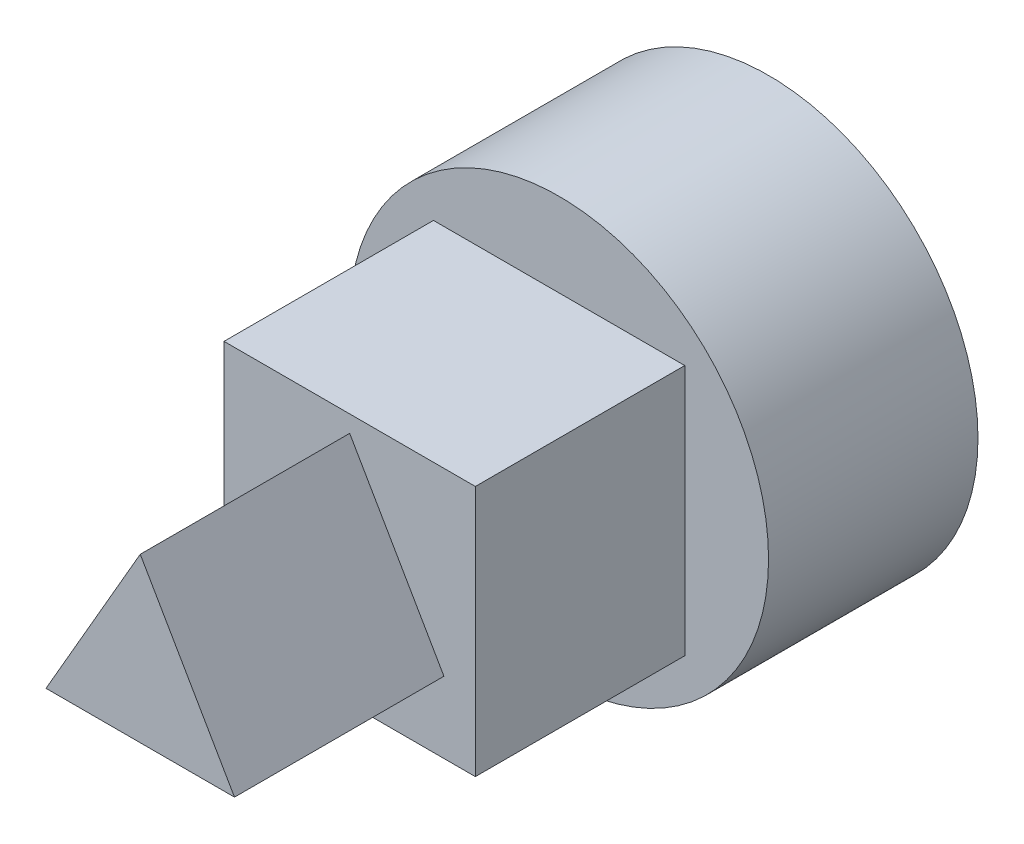
ISO-10303-21;
HEADER;
FILE_DESCRIPTION(('STEP AP214'),'2;1');
FILE_NAME('part.step','',(''),(''),'','','');
FILE_SCHEMA(('AUTOMOTIVE_DESIGN { 1 0 10303 214 1 1 1 1 }'));
ENDSEC;
DATA;
#1=APPLICATION_CONTEXT('core data for automotive mechanical design processes');
#2=APPLICATION_PROTOCOL_DEFINITION('international standard','automotive_design',2000,#1);
#3=PRODUCT_CONTEXT('',#1,'mechanical');
#4=PRODUCT('Part','Part','',(#3));
#5=PRODUCT_RELATED_PRODUCT_CATEGORY('part','',(#4));
#6=PRODUCT_DEFINITION_FORMATION('','',#4);
#7=PRODUCT_DEFINITION_CONTEXT('part definition',#1,'design');
#8=PRODUCT_DEFINITION('design','',#6,#7);
#9=PRODUCT_DEFINITION_SHAPE('','',#8);
#10=(LENGTH_UNIT() NAMED_UNIT(*) SI_UNIT(.MILLI.,.METRE.));
#11=(NAMED_UNIT(*) PLANE_ANGLE_UNIT() SI_UNIT($,.RADIAN.));
#12=(NAMED_UNIT(*) SI_UNIT($,.STERADIAN.) SOLID_ANGLE_UNIT());
#13=UNCERTAINTY_MEASURE_WITH_UNIT(LENGTH_MEASURE(1.E-05),#10,'distance_accuracy_value','');
#14=(GEOMETRIC_REPRESENTATION_CONTEXT(3) GLOBAL_UNCERTAINTY_ASSIGNED_CONTEXT((#13)) GLOBAL_UNIT_ASSIGNED_CONTEXT((#10,
#11,#12)) REPRESENTATION_CONTEXT('',''));
#15=CARTESIAN_POINT('',(0.,0.,0.));
#16=DIRECTION('',(0.,0.,1.));
#17=DIRECTION('',(1.,0.,0.));
#18=AXIS2_PLACEMENT_3D('',#15,#16,#17);
#19=CARTESIAN_POINT('',(0.,-12.9903810567666,150.));
#20=DIRECTION('',(0.,1.,0.));
#21=DIRECTION('',(0.,0.,1.));
#22=AXIS2_PLACEMENT_3D('',#19,#20,#21);
#23=PLANE('',#22);
#24=DIRECTION('',(0.,0.,-1.));
#25=VECTOR('',#24,1.);
#26=CARTESIAN_POINT('',(-22.5,-12.9903810567666,150.));
#27=LINE('',#26,#25);
#28=CARTESIAN_POINT('',(-22.5,-12.9903810567666,150.));
#29=VERTEX_POINT('',#28);
#30=CARTESIAN_POINT('',(-22.5,-12.9903810567666,100.));
#31=VERTEX_POINT('',#30);
#32=EDGE_CURVE('E181',#29,#31,#27,.T.);
#33=ORIENTED_EDGE('',*,*,#32,.T.);
#34=DIRECTION('',(1.,0.,0.));
#35=VECTOR('',#34,1.);
#36=CARTESIAN_POINT('',(0.,-12.9903810567666,100.));
#37=LINE('',#36,#35);
#38=CARTESIAN_POINT('',(22.5,-12.9903810567666,100.));
#39=VERTEX_POINT('',#38);
#40=EDGE_CURVE('E144',#31,#39,#37,.T.);
#41=ORIENTED_EDGE('',*,*,#40,.T.);
#42=DIRECTION('',(0.,0.,-1.));
#43=VECTOR('',#42,1.);
#44=CARTESIAN_POINT('',(22.5,-12.9903810567666,150.));
#45=LINE('',#44,#43);
#46=CARTESIAN_POINT('',(22.5,-12.9903810567666,150.));
#47=VERTEX_POINT('',#46);
#48=EDGE_CURVE('E11',#47,#39,#45,.T.);
#49=ORIENTED_EDGE('',*,*,#48,.F.);
#50=DIRECTION('',(1.,0.,0.));
#51=VECTOR('',#50,1.);
#52=CARTESIAN_POINT('',(0.,-12.9903810567666,150.));
#53=LINE('',#52,#51);
#54=EDGE_CURVE('E171',#29,#47,#53,.T.);
#55=ORIENTED_EDGE('',*,*,#54,.F.);
#56=EDGE_LOOP('',(#33,#41,#49,#55));
#57=FACE_BOUND('',#56,.T.);
#58=ADVANCED_FACE('F43',(#57),#23,.F.);
#59=CARTESIAN_POINT('',(11.25,6.49519052838329,150.));
#60=DIRECTION('',(-0.866025403784439,-0.5,0.));
#61=DIRECTION('',(0.5,-0.866025403784439,0.));
#62=AXIS2_PLACEMENT_3D('',#59,#60,#61);
#63=PLANE('',#62);
#64=ORIENTED_EDGE('',*,*,#48,.T.);
#65=DIRECTION('',(-0.5,0.866025403784439,0.));
#66=VECTOR('',#65,1.);
#67=CARTESIAN_POINT('',(11.25,6.49519052838329,100.));
#68=LINE('',#67,#66);
#69=CARTESIAN_POINT('',(0.,25.9807621135332,100.));
#70=VERTEX_POINT('',#69);
#71=EDGE_CURVE('E136',#39,#70,#68,.T.);
#72=ORIENTED_EDGE('',*,*,#71,.T.);
#73=DIRECTION('',(0.,0.,-1.));
#74=VECTOR('',#73,1.);
#75=CARTESIAN_POINT('',(0.,25.9807621135332,150.));
#76=LINE('',#75,#74);
#77=CARTESIAN_POINT('',(0.,25.9807621135332,150.));
#78=VERTEX_POINT('',#77);
#79=EDGE_CURVE('E51',#78,#70,#76,.T.);
#80=ORIENTED_EDGE('',*,*,#79,.F.);
#81=DIRECTION('',(-0.5,0.866025403784439,0.));
#82=VECTOR('',#81,1.);
#83=CARTESIAN_POINT('',(11.25,6.49519052838329,150.));
#84=LINE('',#83,#82);
#85=EDGE_CURVE('E175',#47,#78,#84,.T.);
#86=ORIENTED_EDGE('',*,*,#85,.F.);
#87=EDGE_LOOP('',(#64,#72,#80,#86));
#88=FACE_BOUND('',#87,.T.);
#89=ADVANCED_FACE('F192',(#88),#63,.F.);
#90=CARTESIAN_POINT('',(-11.25,6.49519052838329,150.));
#91=DIRECTION('',(0.866025403784439,-0.5,0.));
#92=DIRECTION('',(0.5,0.866025403784439,0.));
#93=AXIS2_PLACEMENT_3D('',#90,#91,#92);
#94=PLANE('',#93);
#95=ORIENTED_EDGE('',*,*,#79,.T.);
#96=DIRECTION('',(-0.5,-0.866025403784439,0.));
#97=VECTOR('',#96,1.);
#98=CARTESIAN_POINT('',(-11.25,6.49519052838329,100.));
#99=LINE('',#98,#97);
#100=EDGE_CURVE('E148',#70,#31,#99,.T.);
#101=ORIENTED_EDGE('',*,*,#100,.T.);
#102=ORIENTED_EDGE('',*,*,#32,.F.);
#103=DIRECTION('',(-0.5,-0.866025403784439,0.));
#104=VECTOR('',#103,1.);
#105=CARTESIAN_POINT('',(-11.25,6.49519052838329,150.));
#106=LINE('',#105,#104);
#107=EDGE_CURVE('E178',#78,#29,#106,.T.);
#108=ORIENTED_EDGE('',*,*,#107,.F.);
#109=EDGE_LOOP('',(#95,#101,#102,#108));
#110=FACE_BOUND('',#109,.T.);
#111=ADVANCED_FACE('F189',(#110),#94,.F.);
#112=CARTESIAN_POINT('',(0.,0.,150.));
#113=DIRECTION('',(0.,0.,1.));
#114=DIRECTION('',(1.,0.,0.));
#115=AXIS2_PLACEMENT_3D('',#112,#113,#114);
#116=PLANE('',#115);
#117=ORIENTED_EDGE('',*,*,#54,.T.);
#118=ORIENTED_EDGE('',*,*,#85,.T.);
#119=ORIENTED_EDGE('',*,*,#107,.T.);
#120=EDGE_LOOP('',(#117,#118,#119));
#121=FACE_BOUND('',#120,.T.);
#122=ADVANCED_FACE('F200',(#121),#116,.T.);
#123=CARTESIAN_POINT('',(0.,-30.,100.));
#124=DIRECTION('',(0.,1.,0.));
#125=DIRECTION('',(0.,0.,1.));
#126=AXIS2_PLACEMENT_3D('',#123,#124,#125);
#127=PLANE('',#126);
#128=DIRECTION('',(0.,0.,-1.));
#129=VECTOR('',#128,1.);
#130=CARTESIAN_POINT('',(-30.,-30.,100.));
#131=LINE('',#130,#129);
#132=CARTESIAN_POINT('',(-30.,-30.,100.));
#133=VERTEX_POINT('',#132);
#134=CARTESIAN_POINT('',(-30.,-30.,50.));
#135=VERTEX_POINT('',#134);
#136=EDGE_CURVE('E116',#133,#135,#131,.T.);
#137=ORIENTED_EDGE('',*,*,#136,.T.);
#138=DIRECTION('',(1.,0.,0.));
#139=VECTOR('',#138,1.);
#140=CARTESIAN_POINT('',(0.,-30.,50.));
#141=LINE('',#140,#139);
#142=CARTESIAN_POINT('',(30.,-30.,50.));
#143=VERTEX_POINT('',#142);
#144=EDGE_CURVE('E58',#135,#143,#141,.T.);
#145=ORIENTED_EDGE('',*,*,#144,.T.);
#146=DIRECTION('',(0.,0.,-1.));
#147=VECTOR('',#146,1.);
#148=CARTESIAN_POINT('',(30.,-30.,100.));
#149=LINE('',#148,#147);
#150=CARTESIAN_POINT('',(30.,-30.,100.));
#151=VERTEX_POINT('',#150);
#152=EDGE_CURVE('E168',#151,#143,#149,.T.);
#153=ORIENTED_EDGE('',*,*,#152,.F.);
#154=DIRECTION('',(1.,0.,0.));
#155=VECTOR('',#154,1.);
#156=CARTESIAN_POINT('',(0.,-30.,100.));
#157=LINE('',#156,#155);
#158=EDGE_CURVE('E152',#133,#151,#157,.T.);
#159=ORIENTED_EDGE('',*,*,#158,.F.);
#160=EDGE_LOOP('',(#137,#145,#153,#159));
#161=FACE_BOUND('',#160,.T.);
#162=ADVANCED_FACE('F202',(#161),#127,.F.);
#163=CARTESIAN_POINT('',(30.,0.,100.));
#164=DIRECTION('',(-1.,0.,0.));
#165=DIRECTION('',(0.,0.,1.));
#166=AXIS2_PLACEMENT_3D('',#163,#164,#165);
#167=PLANE('',#166);
#168=ORIENTED_EDGE('',*,*,#152,.T.);
#169=DIRECTION('',(0.,1.,0.));
#170=VECTOR('',#169,1.);
#171=CARTESIAN_POINT('',(30.,0.,50.));
#172=LINE('',#171,#170);
#173=CARTESIAN_POINT('',(30.,30.,50.));
#174=VERTEX_POINT('',#173);
#175=EDGE_CURVE('E65',#143,#174,#172,.T.);
#176=ORIENTED_EDGE('',*,*,#175,.T.);
#177=DIRECTION('',(0.,0.,-1.));
#178=VECTOR('',#177,1.);
#179=CARTESIAN_POINT('',(30.,30.,100.));
#180=LINE('',#179,#178);
#181=CARTESIAN_POINT('',(30.,30.,100.));
#182=VERTEX_POINT('',#181);
#183=EDGE_CURVE('E115',#182,#174,#180,.T.);
#184=ORIENTED_EDGE('',*,*,#183,.F.);
#185=DIRECTION('',(0.,1.,0.));
#186=VECTOR('',#185,1.);
#187=CARTESIAN_POINT('',(30.,0.,100.));
#188=LINE('',#187,#186);
#189=EDGE_CURVE('E156',#151,#182,#188,.T.);
#190=ORIENTED_EDGE('',*,*,#189,.F.);
#191=EDGE_LOOP('',(#168,#176,#184,#190));
#192=FACE_BOUND('',#191,.T.);
#193=ADVANCED_FACE('F208',(#192),#167,.F.);
#194=CARTESIAN_POINT('',(0.,30.,100.));
#195=DIRECTION('',(0.,1.,0.));
#196=DIRECTION('',(0.,0.,1.));
#197=AXIS2_PLACEMENT_3D('',#194,#195,#196);
#198=PLANE('',#197);
#199=DIRECTION('',(1.,0.,0.));
#200=VECTOR('',#199,1.);
#201=CARTESIAN_POINT('',(0.,30.,50.));
#202=LINE('',#201,#200);
#203=CARTESIAN_POINT('',(-30.,30.,50.));
#204=VERTEX_POINT('',#203);
#205=EDGE_CURVE('E119',#204,#174,#202,.T.);
#206=ORIENTED_EDGE('',*,*,#205,.F.);
#207=DIRECTION('',(0.,0.,-1.));
#208=VECTOR('',#207,1.);
#209=CARTESIAN_POINT('',(-30.,30.,100.));
#210=LINE('',#209,#208);
#211=CARTESIAN_POINT('',(-30.,30.,100.));
#212=VERTEX_POINT('',#211);
#213=EDGE_CURVE('E104',#212,#204,#210,.T.);
#214=ORIENTED_EDGE('',*,*,#213,.F.);
#215=DIRECTION('',(1.,0.,0.));
#216=VECTOR('',#215,1.);
#217=CARTESIAN_POINT('',(0.,30.,100.));
#218=LINE('',#217,#216);
#219=EDGE_CURVE('E159',#212,#182,#218,.T.);
#220=ORIENTED_EDGE('',*,*,#219,.T.);
#221=ORIENTED_EDGE('',*,*,#183,.T.);
#222=EDGE_LOOP('',(#206,#214,#220,#221));
#223=FACE_BOUND('',#222,.T.);
#224=ADVANCED_FACE('F120',(#223),#198,.T.);
#225=CARTESIAN_POINT('',(-30.,0.,100.));
#226=DIRECTION('',(-1.,0.,0.));
#227=DIRECTION('',(0.,0.,1.));
#228=AXIS2_PLACEMENT_3D('',#225,#226,#227);
#229=PLANE('',#228);
#230=DIRECTION('',(0.,1.,0.));
#231=VECTOR('',#230,1.);
#232=CARTESIAN_POINT('',(-30.,0.,50.));
#233=LINE('',#232,#231);
#234=EDGE_CURVE('E108',#135,#204,#233,.T.);
#235=ORIENTED_EDGE('',*,*,#234,.F.);
#236=ORIENTED_EDGE('',*,*,#136,.F.);
#237=DIRECTION('',(0.,1.,0.));
#238=VECTOR('',#237,1.);
#239=CARTESIAN_POINT('',(-30.,0.,100.));
#240=LINE('',#239,#238);
#241=EDGE_CURVE('E110',#133,#212,#240,.T.);
#242=ORIENTED_EDGE('',*,*,#241,.T.);
#243=ORIENTED_EDGE('',*,*,#213,.T.);
#244=EDGE_LOOP('',(#235,#236,#242,#243));
#245=FACE_BOUND('',#244,.T.);
#246=ADVANCED_FACE('F106',(#245),#229,.T.);
#247=CARTESIAN_POINT('',(0.,0.,100.));
#248=DIRECTION('',(0.,0.,1.));
#249=DIRECTION('',(1.,0.,0.));
#250=AXIS2_PLACEMENT_3D('',#247,#248,#249);
#251=PLANE('',#250);
#252=ORIENTED_EDGE('',*,*,#71,.F.);
#253=ORIENTED_EDGE('',*,*,#40,.F.);
#254=ORIENTED_EDGE('',*,*,#100,.F.);
#255=EDGE_LOOP('',(#252,#253,#254));
#256=FACE_BOUND('',#255,.T.);
#257=ORIENTED_EDGE('',*,*,#158,.T.);
#258=ORIENTED_EDGE('',*,*,#189,.T.);
#259=ORIENTED_EDGE('',*,*,#219,.F.);
#260=ORIENTED_EDGE('',*,*,#241,.F.);
#261=EDGE_LOOP('',(#257,#258,#259,#260));
#262=FACE_BOUND('',#261,.T.);
#263=ADVANCED_FACE('F195',(#256,#262),#251,.T.);
#264=CARTESIAN_POINT('',(0.,0.,50.));
#265=DIRECTION('',(0.,0.,-1.));
#266=DIRECTION('',(-1.,0.,0.));
#267=AXIS2_PLACEMENT_3D('',#264,#265,#266);
#268=CYLINDRICAL_SURFACE('',#267,50.);
#269=CARTESIAN_POINT('',(0.,0.,50.));
#270=DIRECTION('',(0.,0.,1.));
#271=DIRECTION('',(1.,0.,0.));
#272=AXIS2_PLACEMENT_3D('',#269,#270,#271);
#273=CIRCLE('',#272,50.);
#274=CARTESIAN_POINT('',(50.,0.,50.));
#275=VERTEX_POINT('',#274);
#276=EDGE_CURVE('E123',#275,#275,#273,.T.);
#277=ORIENTED_EDGE('',*,*,#276,.F.);
#278=EDGE_LOOP('',(#277));
#279=FACE_BOUND('',#278,.T.);
#280=CARTESIAN_POINT('',(0.,0.,0.));
#281=DIRECTION('',(0.,0.,1.));
#282=DIRECTION('',(1.,0.,0.));
#283=AXIS2_PLACEMENT_3D('',#280,#281,#282);
#284=CIRCLE('',#283,50.);
#285=CARTESIAN_POINT('',(50.,0.,0.));
#286=VERTEX_POINT('',#285);
#287=EDGE_CURVE('E137',#286,#286,#284,.T.);
#288=ORIENTED_EDGE('',*,*,#287,.T.);
#289=EDGE_LOOP('',(#288));
#290=FACE_BOUND('',#289,.T.);
#291=ADVANCED_FACE('F224',(#279,#290),#268,.T.);
#292=CARTESIAN_POINT('',(0.,0.,50.));
#293=DIRECTION('',(0.,0.,1.));
#294=DIRECTION('',(1.,0.,0.));
#295=AXIS2_PLACEMENT_3D('',#292,#293,#294);
#296=PLANE('',#295);
#297=ORIENTED_EDGE('',*,*,#175,.F.);
#298=ORIENTED_EDGE('',*,*,#144,.F.);
#299=ORIENTED_EDGE('',*,*,#234,.T.);
#300=ORIENTED_EDGE('',*,*,#205,.T.);
#301=EDGE_LOOP('',(#297,#298,#299,#300));
#302=FACE_BOUND('',#301,.T.);
#303=ORIENTED_EDGE('',*,*,#276,.T.);
#304=EDGE_LOOP('',(#303));
#305=FACE_BOUND('',#304,.T.);
#306=ADVANCED_FACE('F125',(#302,#305),#296,.T.);
#307=CARTESIAN_POINT('',(0.,0.,0.));
#308=DIRECTION('',(0.,0.,1.));
#309=DIRECTION('',(1.,0.,0.));
#310=AXIS2_PLACEMENT_3D('',#307,#308,#309);
#311=PLANE('',#310);
#312=ORIENTED_EDGE('',*,*,#287,.F.);
#313=EDGE_LOOP('',(#312));
#314=FACE_BOUND('',#313,.T.);
#315=ADVANCED_FACE('F218',(#314),#311,.F.);
#316=CLOSED_SHELL('',(#58,#89,#111,#122,#162,#193,#224,#246,#263,#291,#306,#315));
#317=MANIFOLD_SOLID_BREP('B2',#316);
#318=ADVANCED_BREP_SHAPE_REPRESENTATION('',(#18,#317),#14);
#319=SHAPE_DEFINITION_REPRESENTATION(#9,#318);
ENDSEC;
END-ISO-10303-21;
